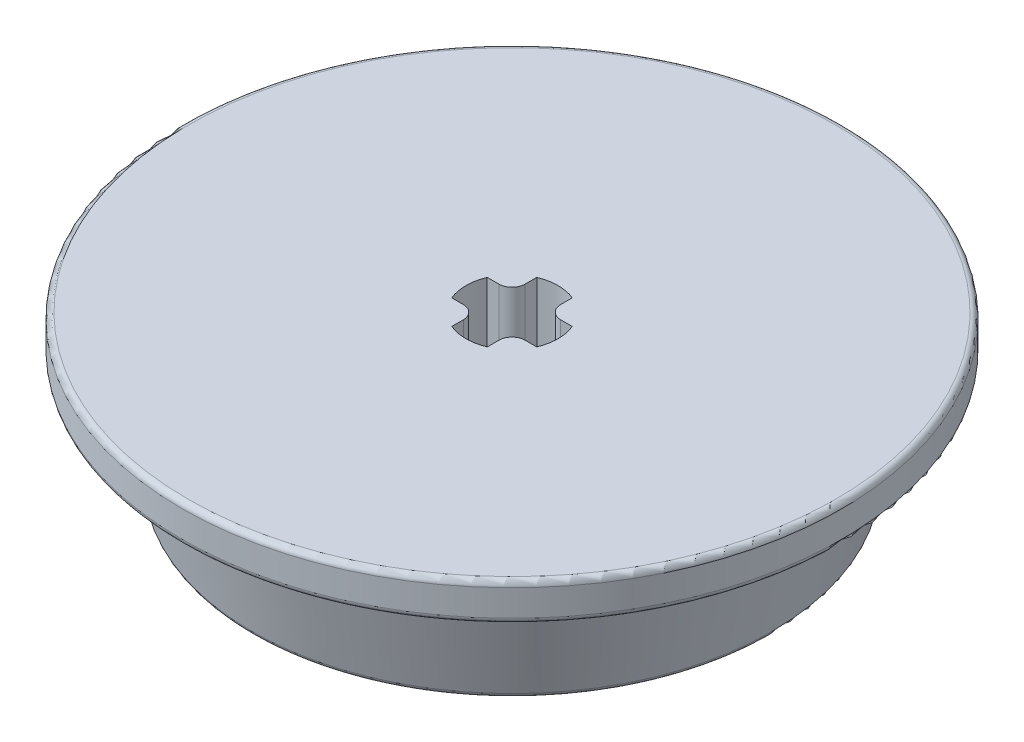
ISO-10303-21;
HEADER;
FILE_DESCRIPTION(('STEP AP214'),'2;1');
FILE_NAME('part.step','',(''),(''),'','','');
FILE_SCHEMA(('AUTOMOTIVE_DESIGN { 1 0 10303 214 1 1 1 1 }'));
ENDSEC;
DATA;
#1=APPLICATION_CONTEXT('core data for automotive mechanical design processes');
#2=APPLICATION_PROTOCOL_DEFINITION('international standard','automotive_design',2000,#1);
#3=PRODUCT_CONTEXT('',#1,'mechanical');
#4=PRODUCT('Part','Part','',(#3));
#5=PRODUCT_RELATED_PRODUCT_CATEGORY('part','',(#4));
#6=PRODUCT_DEFINITION_FORMATION('','',#4);
#7=PRODUCT_DEFINITION_CONTEXT('part definition',#1,'design');
#8=PRODUCT_DEFINITION('design','',#6,#7);
#9=PRODUCT_DEFINITION_SHAPE('','',#8);
#10=(LENGTH_UNIT() NAMED_UNIT(*) SI_UNIT(.MILLI.,.METRE.));
#11=(NAMED_UNIT(*) PLANE_ANGLE_UNIT() SI_UNIT($,.RADIAN.));
#12=(NAMED_UNIT(*) SI_UNIT($,.STERADIAN.) SOLID_ANGLE_UNIT());
#13=UNCERTAINTY_MEASURE_WITH_UNIT(LENGTH_MEASURE(1.E-05),#10,'distance_accuracy_value','');
#14=(GEOMETRIC_REPRESENTATION_CONTEXT(3) GLOBAL_UNCERTAINTY_ASSIGNED_CONTEXT((#13)) GLOBAL_UNIT_ASSIGNED_CONTEXT((#10,
#11,#12)) REPRESENTATION_CONTEXT('',''));
#15=CARTESIAN_POINT('',(0.,0.,0.));
#16=DIRECTION('',(0.,0.,1.));
#17=DIRECTION('',(1.,0.,0.));
#18=AXIS2_PLACEMENT_3D('',#15,#16,#17);
#19=CARTESIAN_POINT('',(0.,0.,0.));
#20=DIRECTION('',(0.,1.,0.));
#21=DIRECTION('',(0.,0.,1.));
#22=AXIS2_PLACEMENT_3D('',#19,#20,#21);
#23=PLANE('',#22);
#24=CARTESIAN_POINT('',(0.,0.,0.));
#25=DIRECTION('',(0.,1.,0.));
#26=DIRECTION('',(0.,0.,1.));
#27=AXIS2_PLACEMENT_3D('',#24,#25,#26);
#28=CIRCLE('',#27,17.1604709958205);
#29=CARTESIAN_POINT('',(0.,0.,17.1604709958205));
#30=VERTEX_POINT('',#29);
#31=EDGE_CURVE('E293',#30,#30,#28,.T.);
#32=ORIENTED_EDGE('',*,*,#31,.T.);
#33=EDGE_LOOP('',(#32));
#34=FACE_BOUND('',#33,.T.);
#35=DIRECTION('',(0.,0.,1.));
#36=VECTOR('',#35,1.);
#37=CARTESIAN_POINT('',(-0.940000000000001,0.,0.940000000000009));
#38=LINE('',#37,#36);
#39=CARTESIAN_POINT('',(-0.940000000000001,0.,1.64000000000001));
#40=VERTEX_POINT('',#39);
#41=CARTESIAN_POINT('',(-0.94,0.,2.25166604983954));
#42=VERTEX_POINT('',#41);
#43=EDGE_CURVE('E210',#40,#42,#38,.T.);
#44=ORIENTED_EDGE('',*,*,#43,.F.);
#45=CARTESIAN_POINT('',(-1.64,0.,1.64000000000001));
#46=DIRECTION('',(0.,1.,0.));
#47=DIRECTION('',(0.,0.,1.));
#48=AXIS2_PLACEMENT_3D('',#45,#46,#47);
#49=CIRCLE('',#48,0.7);
#50=CARTESIAN_POINT('',(-1.64,0.,0.940000000000009));
#51=VERTEX_POINT('',#50);
#52=EDGE_CURVE('E254',#40,#51,#49,.T.);
#53=ORIENTED_EDGE('',*,*,#52,.T.);
#54=DIRECTION('',(1.,0.,0.));
#55=VECTOR('',#54,1.);
#56=CARTESIAN_POINT('',(-2.25166604983954,0.,0.940000000000009));
#57=LINE('',#56,#55);
#58=CARTESIAN_POINT('',(-2.25166604983954,0.,0.940000000000008));
#59=VERTEX_POINT('',#58);
#60=EDGE_CURVE('E208',#59,#51,#57,.T.);
#61=ORIENTED_EDGE('',*,*,#60,.F.);
#62=CARTESIAN_POINT('',(0.,0.,0.));
#63=DIRECTION('',(0.,1.,0.));
#64=DIRECTION('',(0.,0.,1.));
#65=AXIS2_PLACEMENT_3D('',#62,#63,#64);
#66=CIRCLE('',#65,2.44);
#67=CARTESIAN_POINT('',(-2.25166604983954,0.,-0.940000000000009));
#68=VERTEX_POINT('',#67);
#69=EDGE_CURVE('E160',#68,#59,#66,.T.);
#70=ORIENTED_EDGE('',*,*,#69,.F.);
#71=DIRECTION('',(-1.,0.,0.));
#72=VECTOR('',#71,1.);
#73=CARTESIAN_POINT('',(-0.94,0.,-0.940000000000009));
#74=LINE('',#73,#72);
#75=CARTESIAN_POINT('',(-1.64,0.,-0.940000000000009));
#76=VERTEX_POINT('',#75);
#77=EDGE_CURVE('E205',#76,#68,#74,.T.);
#78=ORIENTED_EDGE('',*,*,#77,.F.);
#79=CARTESIAN_POINT('',(-1.64,0.,-1.64000000000001));
#80=DIRECTION('',(0.,1.,0.));
#81=DIRECTION('',(0.,0.,1.));
#82=AXIS2_PLACEMENT_3D('',#79,#80,#81);
#83=CIRCLE('',#82,0.7);
#84=CARTESIAN_POINT('',(-0.94,0.,-1.64000000000001));
#85=VERTEX_POINT('',#84);
#86=EDGE_CURVE('E248',#76,#85,#83,.T.);
#87=ORIENTED_EDGE('',*,*,#86,.T.);
#88=DIRECTION('',(0.,0.,1.));
#89=VECTOR('',#88,1.);
#90=CARTESIAN_POINT('',(-0.94,0.,-2.25166604983954));
#91=LINE('',#90,#89);
#92=CARTESIAN_POINT('',(-0.940000000000001,0.,-2.25166604983954));
#93=VERTEX_POINT('',#92);
#94=EDGE_CURVE('E202',#93,#85,#91,.T.);
#95=ORIENTED_EDGE('',*,*,#94,.F.);
#96=CARTESIAN_POINT('',(0.,0.,0.));
#97=DIRECTION('',(0.,1.,0.));
#98=DIRECTION('',(0.,0.,-1.));
#99=AXIS2_PLACEMENT_3D('',#96,#97,#98);
#100=CIRCLE('',#99,2.44);
#101=CARTESIAN_POINT('',(0.94,0.,-2.25166604983954));
#102=VERTEX_POINT('',#101);
#103=EDGE_CURVE('E227',#102,#93,#100,.T.);
#104=ORIENTED_EDGE('',*,*,#103,.F.);
#105=DIRECTION('',(0.,0.,-1.));
#106=VECTOR('',#105,1.);
#107=CARTESIAN_POINT('',(0.94,0.,-2.25166604983954));
#108=LINE('',#107,#106);
#109=CARTESIAN_POINT('',(0.94,0.,-1.64));
#110=VERTEX_POINT('',#109);
#111=EDGE_CURVE('E225',#110,#102,#108,.T.);
#112=ORIENTED_EDGE('',*,*,#111,.F.);
#113=CARTESIAN_POINT('',(1.64,0.,-1.64));
#114=DIRECTION('',(0.,1.,0.));
#115=DIRECTION('',(0.,0.,1.));
#116=AXIS2_PLACEMENT_3D('',#113,#114,#115);
#117=CIRCLE('',#116,0.7);
#118=CARTESIAN_POINT('',(1.64,0.,-0.940000000000003));
#119=VERTEX_POINT('',#118);
#120=EDGE_CURVE('E250',#110,#119,#117,.T.);
#121=ORIENTED_EDGE('',*,*,#120,.T.);
#122=DIRECTION('',(-1.,0.,0.));
#123=VECTOR('',#122,1.);
#124=CARTESIAN_POINT('',(0.94,0.,-0.940000000000003));
#125=LINE('',#124,#123);
#126=CARTESIAN_POINT('',(2.25166604983954,0.,-0.940000000000003));
#127=VERTEX_POINT('',#126);
#128=EDGE_CURVE('E223',#127,#119,#125,.T.);
#129=ORIENTED_EDGE('',*,*,#128,.F.);
#130=CARTESIAN_POINT('',(0.,0.,0.));
#131=DIRECTION('',(0.,1.,0.));
#132=DIRECTION('',(0.,0.,-1.));
#133=AXIS2_PLACEMENT_3D('',#130,#131,#132);
#134=CIRCLE('',#133,2.44);
#135=CARTESIAN_POINT('',(2.25166604983954,0.,0.940000000000003));
#136=VERTEX_POINT('',#135);
#137=EDGE_CURVE('E220',#136,#127,#134,.T.);
#138=ORIENTED_EDGE('',*,*,#137,.F.);
#139=DIRECTION('',(1.,0.,0.));
#140=VECTOR('',#139,1.);
#141=CARTESIAN_POINT('',(0.940000000000001,0.,0.940000000000003));
#142=LINE('',#141,#140);
#143=CARTESIAN_POINT('',(1.64,0.,0.940000000000003));
#144=VERTEX_POINT('',#143);
#145=EDGE_CURVE('E218',#144,#136,#142,.T.);
#146=ORIENTED_EDGE('',*,*,#145,.F.);
#147=CARTESIAN_POINT('',(1.64,0.,1.64));
#148=DIRECTION('',(0.,1.,0.));
#149=DIRECTION('',(0.,0.,1.));
#150=AXIS2_PLACEMENT_3D('',#147,#148,#149);
#151=CIRCLE('',#150,0.7);
#152=CARTESIAN_POINT('',(0.940000000000001,0.,1.64));
#153=VERTEX_POINT('',#152);
#154=EDGE_CURVE('E252',#144,#153,#151,.T.);
#155=ORIENTED_EDGE('',*,*,#154,.T.);
#156=DIRECTION('',(0.,0.,-1.));
#157=VECTOR('',#156,1.);
#158=CARTESIAN_POINT('',(0.940000000000001,0.,2.25166604983954));
#159=LINE('',#158,#157);
#160=CARTESIAN_POINT('',(0.94,0.,2.25166604983954));
#161=VERTEX_POINT('',#160);
#162=EDGE_CURVE('E215',#161,#153,#159,.T.);
#163=ORIENTED_EDGE('',*,*,#162,.F.);
#164=CARTESIAN_POINT('',(0.,0.,0.));
#165=DIRECTION('',(0.,1.,0.));
#166=DIRECTION('',(0.,0.,1.));
#167=AXIS2_PLACEMENT_3D('',#164,#165,#166);
#168=CIRCLE('',#167,2.44);
#169=EDGE_CURVE('E212',#42,#161,#168,.T.);
#170=ORIENTED_EDGE('',*,*,#169,.F.);
#171=EDGE_LOOP('',(#44,#53,#61,#70,#78,#87,#95,#104,#112,#121,#129,#138,#146,#155,#163,#170));
#172=FACE_BOUND('',#171,.T.);
#173=ADVANCED_FACE('F37',(#34,#172),#23,.T.);
#174=CARTESIAN_POINT('',(0.,0.,0.));
#175=DIRECTION('',(0.,-1.,0.));
#176=DIRECTION('',(0.,0.,-1.));
#177=AXIS2_PLACEMENT_3D('',#174,#175,#176);
#178=CYLINDRICAL_SURFACE('',#177,17.4604709958205);
#179=CARTESIAN_POINT('',(0.,-0.3,0.));
#180=DIRECTION('',(0.,1.,0.));
#181=DIRECTION('',(0.,0.,1.));
#182=AXIS2_PLACEMENT_3D('',#179,#180,#181);
#183=CIRCLE('',#182,17.4604709958205);
#184=CARTESIAN_POINT('',(0.,-0.3,17.4604709958205));
#185=VERTEX_POINT('',#184);
#186=EDGE_CURVE('E290',#185,#185,#183,.F.);
#187=ORIENTED_EDGE('',*,*,#186,.T.);
#188=EDGE_LOOP('',(#187));
#189=FACE_BOUND('',#188,.T.);
#190=CARTESIAN_POINT('',(0.,-1.7,0.));
#191=DIRECTION('',(0.,-1.,0.));
#192=DIRECTION('',(0.,0.,-1.));
#193=AXIS2_PLACEMENT_3D('',#190,#191,#192);
#194=CIRCLE('',#193,17.4604709958205);
#195=CARTESIAN_POINT('',(0.,-1.7,-17.4604709958205));
#196=VERTEX_POINT('',#195);
#197=EDGE_CURVE('E287',#196,#196,#194,.F.);
#198=ORIENTED_EDGE('',*,*,#197,.T.);
#199=EDGE_LOOP('',(#198));
#200=FACE_BOUND('',#199,.T.);
#201=ADVANCED_FACE('F310',(#189,#200),#178,.T.);
#202=CARTESIAN_POINT('',(17.4604709958205,-2.,0.));
#203=DIRECTION('',(0.,-1.,0.));
#204=DIRECTION('',(0.,0.,-1.));
#205=AXIS2_PLACEMENT_3D('',#202,#203,#204);
#206=PLANE('',#205);
#207=CARTESIAN_POINT('',(0.,-2.,0.));
#208=DIRECTION('',(0.,-1.,0.));
#209=DIRECTION('',(0.,0.,-1.));
#210=AXIS2_PLACEMENT_3D('',#207,#208,#209);
#211=CIRCLE('',#210,15.2429352099588);
#212=CARTESIAN_POINT('',(0.,-2.,-15.2429352099588));
#213=VERTEX_POINT('',#212);
#214=EDGE_CURVE('E11',#213,#213,#211,.F.);
#215=ORIENTED_EDGE('',*,*,#214,.T.);
#216=EDGE_LOOP('',(#215));
#217=FACE_BOUND('',#216,.T.);
#218=CARTESIAN_POINT('',(0.,-2.,0.));
#219=DIRECTION('',(0.,-1.,0.));
#220=DIRECTION('',(0.,0.,-1.));
#221=AXIS2_PLACEMENT_3D('',#218,#219,#220);
#222=CIRCLE('',#221,17.1604709958205);
#223=CARTESIAN_POINT('',(0.,-2.,-17.1604709958205));
#224=VERTEX_POINT('',#223);
#225=EDGE_CURVE('E45',#224,#224,#222,.T.);
#226=ORIENTED_EDGE('',*,*,#225,.T.);
#227=EDGE_LOOP('',(#226));
#228=FACE_BOUND('',#227,.T.);
#229=ADVANCED_FACE('F298',(#217,#228),#206,.T.);
#230=CARTESIAN_POINT('',(0.,-8.,0.));
#231=DIRECTION('',(0.,1.,0.));
#232=DIRECTION('',(0.,0.,1.));
#233=AXIS2_PLACEMENT_3D('',#230,#231,#232);
#234=CONICAL_SURFACE('',#233,13.7246606299877,0.209439510238075);
#235=CARTESIAN_POINT('',(0.,-7.76237350724496,0.));
#236=DIRECTION('',(0.,-1.,0.));
#237=DIRECTION('',(0.,0.,-1.));
#238=AXIS2_PLACEMENT_3D('',#235,#236,#237);
#239=CIRCLE('',#238,13.7751697002491);
#240=CARTESIAN_POINT('',(0.,-7.76237350724496,-13.7751697002491));
#241=VERTEX_POINT('',#240);
#242=EDGE_CURVE('E284',#241,#241,#239,.F.);
#243=ORIENTED_EDGE('',*,*,#242,.T.);
#244=EDGE_LOOP('',(#243));
#245=FACE_BOUND('',#244,.T.);
#246=CARTESIAN_POINT('',(0.,-2.23762649275504,0.));
#247=DIRECTION('',(0.,1.,0.));
#248=DIRECTION('',(0.,0.,1.));
#249=AXIS2_PLACEMENT_3D('',#246,#247,#248);
#250=CIRCLE('',#249,14.9494909297386);
#251=CARTESIAN_POINT('',(0.,-2.23762649275504,14.9494909297386));
#252=VERTEX_POINT('',#251);
#253=EDGE_CURVE('E281',#252,#252,#250,.F.);
#254=ORIENTED_EDGE('',*,*,#253,.T.);
#255=EDGE_LOOP('',(#254));
#256=FACE_BOUND('',#255,.T.);
#257=ADVANCED_FACE('F520',(#245,#256),#234,.T.);
#258=CARTESIAN_POINT('',(13.7246606299877,-8.,0.));
#259=DIRECTION('',(0.,-1.,0.));
#260=DIRECTION('',(0.,0.,-1.));
#261=AXIS2_PLACEMENT_3D('',#258,#259,#260);
#262=PLANE('',#261);
#263=CARTESIAN_POINT('',(0.,-8.,0.));
#264=DIRECTION('',(0.,-1.,0.));
#265=DIRECTION('',(0.,0.,-1.));
#266=AXIS2_PLACEMENT_3D('',#263,#264,#265);
#267=CIRCLE('',#266,13.4817254200289);
#268=CARTESIAN_POINT('',(0.,-8.,-13.4817254200289));
#269=VERTEX_POINT('',#268);
#270=EDGE_CURVE('E278',#269,#269,#267,.T.);
#271=ORIENTED_EDGE('',*,*,#270,.T.);
#272=EDGE_LOOP('',(#271));
#273=FACE_BOUND('',#272,.T.);
#274=DIRECTION('',(1.,0.,0.));
#275=VECTOR('',#274,1.);
#276=CARTESIAN_POINT('',(-2.25166604983954,-8.,0.940000000000009));
#277=LINE('',#276,#275);
#278=CARTESIAN_POINT('',(-2.25166604983954,-8.,0.940000000000008));
#279=VERTEX_POINT('',#278);
#280=CARTESIAN_POINT('',(-1.64,-8.,0.940000000000009));
#281=VERTEX_POINT('',#280);
#282=EDGE_CURVE('E168',#279,#281,#277,.T.);
#283=ORIENTED_EDGE('',*,*,#282,.T.);
#284=CARTESIAN_POINT('',(-1.64,-8.,1.64000000000001));
#285=DIRECTION('',(0.,-1.,0.));
#286=DIRECTION('',(0.,0.,-1.));
#287=AXIS2_PLACEMENT_3D('',#284,#285,#286);
#288=CIRCLE('',#287,0.7);
#289=CARTESIAN_POINT('',(-0.940000000000001,-8.,1.64000000000001));
#290=VERTEX_POINT('',#289);
#291=EDGE_CURVE('E262',#281,#290,#288,.T.);
#292=ORIENTED_EDGE('',*,*,#291,.T.);
#293=DIRECTION('',(0.,0.,1.));
#294=VECTOR('',#293,1.);
#295=CARTESIAN_POINT('',(-0.940000000000001,-8.,0.940000000000009));
#296=LINE('',#295,#294);
#297=CARTESIAN_POINT('',(-0.94,-8.,2.25166604983954));
#298=VERTEX_POINT('',#297);
#299=EDGE_CURVE('E173',#290,#298,#296,.T.);
#300=ORIENTED_EDGE('',*,*,#299,.T.);
#301=CARTESIAN_POINT('',(0.,-8.,0.));
#302=DIRECTION('',(0.,1.,0.));
#303=DIRECTION('',(0.,0.,1.));
#304=AXIS2_PLACEMENT_3D('',#301,#302,#303);
#305=CIRCLE('',#304,2.44);
#306=CARTESIAN_POINT('',(0.94,-8.,2.25166604983954));
#307=VERTEX_POINT('',#306);
#308=EDGE_CURVE('E184',#298,#307,#305,.T.);
#309=ORIENTED_EDGE('',*,*,#308,.T.);
#310=DIRECTION('',(0.,0.,-1.));
#311=VECTOR('',#310,1.);
#312=CARTESIAN_POINT('',(0.940000000000001,-8.,2.25166604983954));
#313=LINE('',#312,#311);
#314=CARTESIAN_POINT('',(0.940000000000001,-8.,1.64));
#315=VERTEX_POINT('',#314);
#316=EDGE_CURVE('E187',#307,#315,#313,.T.);
#317=ORIENTED_EDGE('',*,*,#316,.T.);
#318=CARTESIAN_POINT('',(1.64,-8.,1.64));
#319=DIRECTION('',(0.,-1.,0.));
#320=DIRECTION('',(0.,0.,-1.));
#321=AXIS2_PLACEMENT_3D('',#318,#319,#320);
#322=CIRCLE('',#321,0.7);
#323=CARTESIAN_POINT('',(1.64,-8.,0.940000000000003));
#324=VERTEX_POINT('',#323);
#325=EDGE_CURVE('E260',#315,#324,#322,.T.);
#326=ORIENTED_EDGE('',*,*,#325,.T.);
#327=DIRECTION('',(1.,0.,0.));
#328=VECTOR('',#327,1.);
#329=CARTESIAN_POINT('',(0.940000000000001,-8.,0.940000000000003));
#330=LINE('',#329,#328);
#331=CARTESIAN_POINT('',(2.25166604983954,-8.,0.940000000000003));
#332=VERTEX_POINT('',#331);
#333=EDGE_CURVE('E190',#324,#332,#330,.T.);
#334=ORIENTED_EDGE('',*,*,#333,.T.);
#335=CARTESIAN_POINT('',(0.,-8.,0.));
#336=DIRECTION('',(0.,1.,0.));
#337=DIRECTION('',(0.,0.,-1.));
#338=AXIS2_PLACEMENT_3D('',#335,#336,#337);
#339=CIRCLE('',#338,2.44);
#340=CARTESIAN_POINT('',(2.25166604983954,-8.,-0.940000000000003));
#341=VERTEX_POINT('',#340);
#342=EDGE_CURVE('E192',#332,#341,#339,.T.);
#343=ORIENTED_EDGE('',*,*,#342,.T.);
#344=DIRECTION('',(-1.,0.,0.));
#345=VECTOR('',#344,1.);
#346=CARTESIAN_POINT('',(0.94,-8.,-0.940000000000003));
#347=LINE('',#346,#345);
#348=CARTESIAN_POINT('',(1.64,-8.,-0.940000000000003));
#349=VERTEX_POINT('',#348);
#350=EDGE_CURVE('E195',#341,#349,#347,.T.);
#351=ORIENTED_EDGE('',*,*,#350,.T.);
#352=CARTESIAN_POINT('',(1.64,-8.,-1.64));
#353=DIRECTION('',(0.,-1.,0.));
#354=DIRECTION('',(0.,0.,-1.));
#355=AXIS2_PLACEMENT_3D('',#352,#353,#354);
#356=CIRCLE('',#355,0.7);
#357=CARTESIAN_POINT('',(0.94,-8.,-1.64));
#358=VERTEX_POINT('',#357);
#359=EDGE_CURVE('E52',#349,#358,#356,.T.);
#360=ORIENTED_EDGE('',*,*,#359,.T.);
#361=DIRECTION('',(0.,0.,-1.));
#362=VECTOR('',#361,1.);
#363=CARTESIAN_POINT('',(0.94,-8.,-2.25166604983954));
#364=LINE('',#363,#362);
#365=CARTESIAN_POINT('',(0.94,-8.,-2.25166604983954));
#366=VERTEX_POINT('',#365);
#367=EDGE_CURVE('E197',#358,#366,#364,.T.);
#368=ORIENTED_EDGE('',*,*,#367,.T.);
#369=CARTESIAN_POINT('',(0.,-8.,0.));
#370=DIRECTION('',(0.,1.,0.));
#371=DIRECTION('',(0.,0.,-1.));
#372=AXIS2_PLACEMENT_3D('',#369,#370,#371);
#373=CIRCLE('',#372,2.44);
#374=CARTESIAN_POINT('',(-0.940000000000001,-8.,-2.25166604983954));
#375=VERTEX_POINT('',#374);
#376=EDGE_CURVE('E199',#366,#375,#373,.T.);
#377=ORIENTED_EDGE('',*,*,#376,.T.);
#378=DIRECTION('',(0.,0.,1.));
#379=VECTOR('',#378,1.);
#380=CARTESIAN_POINT('',(-0.94,-8.,-2.25166604983954));
#381=LINE('',#380,#379);
#382=CARTESIAN_POINT('',(-0.94,-8.,-1.64000000000001));
#383=VERTEX_POINT('',#382);
#384=EDGE_CURVE('E179',#375,#383,#381,.T.);
#385=ORIENTED_EDGE('',*,*,#384,.T.);
#386=CARTESIAN_POINT('',(-1.64,-8.,-1.64000000000001));
#387=DIRECTION('',(0.,-1.,0.));
#388=DIRECTION('',(0.,0.,-1.));
#389=AXIS2_PLACEMENT_3D('',#386,#387,#388);
#390=CIRCLE('',#389,0.7);
#391=CARTESIAN_POINT('',(-1.64,-8.,-0.940000000000009));
#392=VERTEX_POINT('',#391);
#393=EDGE_CURVE('E257',#383,#392,#390,.T.);
#394=ORIENTED_EDGE('',*,*,#393,.T.);
#395=DIRECTION('',(-1.,0.,0.));
#396=VECTOR('',#395,1.);
#397=CARTESIAN_POINT('',(-0.94,-8.,-0.940000000000009));
#398=LINE('',#397,#396);
#399=CARTESIAN_POINT('',(-2.25166604983954,-8.,-0.940000000000009));
#400=VERTEX_POINT('',#399);
#401=EDGE_CURVE('E177',#392,#400,#398,.T.);
#402=ORIENTED_EDGE('',*,*,#401,.T.);
#403=CARTESIAN_POINT('',(0.,-8.,0.));
#404=DIRECTION('',(0.,1.,0.));
#405=DIRECTION('',(0.,0.,1.));
#406=AXIS2_PLACEMENT_3D('',#403,#404,#405);
#407=CIRCLE('',#406,2.44);
#408=EDGE_CURVE('E157',#400,#279,#407,.T.);
#409=ORIENTED_EDGE('',*,*,#408,.T.);
#410=EDGE_LOOP('',(#283,#292,#300,#309,#317,#326,#334,#343,#351,#360,#368,#377,#385,#394,#402,#409));
#411=FACE_BOUND('',#410,.T.);
#412=ADVANCED_FACE('F175',(#273,#411),#262,.T.);
#413=CARTESIAN_POINT('',(-0.94,-8.,-2.25166604983954));
#414=DIRECTION('',(-1.,0.,0.));
#415=DIRECTION('',(0.,0.,1.));
#416=AXIS2_PLACEMENT_3D('',#413,#414,#415);
#417=PLANE('',#416);
#418=ORIENTED_EDGE('',*,*,#94,.T.);
#419=DIRECTION('',(0.,1.,0.));
#420=VECTOR('',#419,1.);
#421=CARTESIAN_POINT('',(-0.94,-8.,-1.64000000000001));
#422=LINE('',#421,#420);
#423=EDGE_CURVE('E276',#85,#383,#422,.F.);
#424=ORIENTED_EDGE('',*,*,#423,.T.);
#425=ORIENTED_EDGE('',*,*,#384,.F.);
#426=DIRECTION('',(0.,1.,0.));
#427=VECTOR('',#426,1.);
#428=CARTESIAN_POINT('',(-0.940000000000001,-8.,-2.25166604983954));
#429=LINE('',#428,#427);
#430=EDGE_CURVE('E230',#375,#93,#429,.T.);
#431=ORIENTED_EDGE('',*,*,#430,.T.);
#432=EDGE_LOOP('',(#418,#424,#425,#431));
#433=FACE_BOUND('',#432,.T.);
#434=ADVANCED_FACE('F501',(#433),#417,.F.);
#435=CARTESIAN_POINT('',(0.,-8.,0.));
#436=DIRECTION('',(0.,1.,0.));
#437=DIRECTION('',(0.,0.,1.));
#438=AXIS2_PLACEMENT_3D('',#435,#436,#437);
#439=CYLINDRICAL_SURFACE('',#438,2.44);
#440=ORIENTED_EDGE('',*,*,#103,.T.);
#441=ORIENTED_EDGE('',*,*,#430,.F.);
#442=ORIENTED_EDGE('',*,*,#376,.F.);
#443=DIRECTION('',(0.,1.,0.));
#444=VECTOR('',#443,1.);
#445=CARTESIAN_POINT('',(0.94,-8.,-2.25166604983954));
#446=LINE('',#445,#444);
#447=EDGE_CURVE('E233',#366,#102,#446,.T.);
#448=ORIENTED_EDGE('',*,*,#447,.T.);
#449=EDGE_LOOP('',(#440,#441,#442,#448));
#450=FACE_BOUND('',#449,.T.);
#451=ADVANCED_FACE('F491',(#450),#439,.F.);
#452=CARTESIAN_POINT('',(0.94,-8.,-2.25166604983954));
#453=DIRECTION('',(1.,0.,0.));
#454=DIRECTION('',(0.,0.,-1.));
#455=AXIS2_PLACEMENT_3D('',#452,#453,#454);
#456=PLANE('',#455);
#457=ORIENTED_EDGE('',*,*,#367,.F.);
#458=DIRECTION('',(0.,1.,0.));
#459=VECTOR('',#458,1.);
#460=CARTESIAN_POINT('',(0.94,-8.,-1.64));
#461=LINE('',#460,#459);
#462=EDGE_CURVE('E269',#358,#110,#461,.T.);
#463=ORIENTED_EDGE('',*,*,#462,.T.);
#464=ORIENTED_EDGE('',*,*,#111,.T.);
#465=ORIENTED_EDGE('',*,*,#447,.F.);
#466=EDGE_LOOP('',(#457,#463,#464,#465));
#467=FACE_BOUND('',#466,.T.);
#468=ADVANCED_FACE('F482',(#467),#456,.F.);
#469=CARTESIAN_POINT('',(0.94,-8.,-0.940000000000003));
#470=DIRECTION('',(0.,0.,-1.));
#471=DIRECTION('',(-1.,0.,0.));
#472=AXIS2_PLACEMENT_3D('',#469,#470,#471);
#473=PLANE('',#472);
#474=ORIENTED_EDGE('',*,*,#128,.T.);
#475=DIRECTION('',(0.,1.,0.));
#476=VECTOR('',#475,1.);
#477=CARTESIAN_POINT('',(1.64,-8.,-0.940000000000003));
#478=LINE('',#477,#476);
#479=EDGE_CURVE('E60',#119,#349,#478,.F.);
#480=ORIENTED_EDGE('',*,*,#479,.T.);
#481=ORIENTED_EDGE('',*,*,#350,.F.);
#482=DIRECTION('',(0.,1.,0.));
#483=VECTOR('',#482,1.);
#484=CARTESIAN_POINT('',(2.25166604983954,-8.,-0.940000000000003));
#485=LINE('',#484,#483);
#486=EDGE_CURVE('E236',#341,#127,#485,.T.);
#487=ORIENTED_EDGE('',*,*,#486,.T.);
#488=EDGE_LOOP('',(#474,#480,#481,#487));
#489=FACE_BOUND('',#488,.T.);
#490=ADVANCED_FACE('F472',(#489),#473,.F.);
#491=CARTESIAN_POINT('',(0.,-8.,0.));
#492=DIRECTION('',(0.,1.,0.));
#493=DIRECTION('',(0.,0.,1.));
#494=AXIS2_PLACEMENT_3D('',#491,#492,#493);
#495=CYLINDRICAL_SURFACE('',#494,2.44);
#496=ORIENTED_EDGE('',*,*,#137,.T.);
#497=ORIENTED_EDGE('',*,*,#486,.F.);
#498=ORIENTED_EDGE('',*,*,#342,.F.);
#499=DIRECTION('',(0.,1.,0.));
#500=VECTOR('',#499,1.);
#501=CARTESIAN_POINT('',(2.25166604983954,-8.,0.940000000000003));
#502=LINE('',#501,#500);
#503=EDGE_CURVE('E238',#332,#136,#502,.T.);
#504=ORIENTED_EDGE('',*,*,#503,.T.);
#505=EDGE_LOOP('',(#496,#497,#498,#504));
#506=FACE_BOUND('',#505,.T.);
#507=ADVANCED_FACE('F462',(#506),#495,.F.);
#508=CARTESIAN_POINT('',(0.940000000000001,-8.,0.940000000000003));
#509=DIRECTION('',(0.,0.,1.));
#510=DIRECTION('',(1.,0.,0.));
#511=AXIS2_PLACEMENT_3D('',#508,#509,#510);
#512=PLANE('',#511);
#513=ORIENTED_EDGE('',*,*,#333,.F.);
#514=DIRECTION('',(0.,1.,0.));
#515=VECTOR('',#514,1.);
#516=CARTESIAN_POINT('',(1.64,-8.,0.940000000000003));
#517=LINE('',#516,#515);
#518=EDGE_CURVE('E264',#324,#144,#517,.T.);
#519=ORIENTED_EDGE('',*,*,#518,.T.);
#520=ORIENTED_EDGE('',*,*,#145,.T.);
#521=ORIENTED_EDGE('',*,*,#503,.F.);
#522=EDGE_LOOP('',(#513,#519,#520,#521));
#523=FACE_BOUND('',#522,.T.);
#524=ADVANCED_FACE('F452',(#523),#512,.F.);
#525=CARTESIAN_POINT('',(0.940000000000001,-8.,2.25166604983954));
#526=DIRECTION('',(1.,0.,0.));
#527=DIRECTION('',(0.,0.,-1.));
#528=AXIS2_PLACEMENT_3D('',#525,#526,#527);
#529=PLANE('',#528);
#530=ORIENTED_EDGE('',*,*,#162,.T.);
#531=DIRECTION('',(0.,1.,0.));
#532=VECTOR('',#531,1.);
#533=CARTESIAN_POINT('',(0.940000000000001,-8.,1.64));
#534=LINE('',#533,#532);
#535=EDGE_CURVE('E267',#153,#315,#534,.F.);
#536=ORIENTED_EDGE('',*,*,#535,.T.);
#537=ORIENTED_EDGE('',*,*,#316,.F.);
#538=DIRECTION('',(0.,1.,0.));
#539=VECTOR('',#538,1.);
#540=CARTESIAN_POINT('',(0.94,-8.,2.25166604983954));
#541=LINE('',#540,#539);
#542=EDGE_CURVE('E241',#307,#161,#541,.T.);
#543=ORIENTED_EDGE('',*,*,#542,.T.);
#544=EDGE_LOOP('',(#530,#536,#537,#543));
#545=FACE_BOUND('',#544,.T.);
#546=ADVANCED_FACE('F442',(#545),#529,.F.);
#547=CARTESIAN_POINT('',(0.,-8.,0.));
#548=DIRECTION('',(0.,1.,0.));
#549=DIRECTION('',(0.,0.,1.));
#550=AXIS2_PLACEMENT_3D('',#547,#548,#549);
#551=CYLINDRICAL_SURFACE('',#550,2.44);
#552=ORIENTED_EDGE('',*,*,#169,.T.);
#553=ORIENTED_EDGE('',*,*,#542,.F.);
#554=ORIENTED_EDGE('',*,*,#308,.F.);
#555=DIRECTION('',(0.,1.,0.));
#556=VECTOR('',#555,1.);
#557=CARTESIAN_POINT('',(-0.94,-8.,2.25166604983954));
#558=LINE('',#557,#556);
#559=EDGE_CURVE('E164',#298,#42,#558,.T.);
#560=ORIENTED_EDGE('',*,*,#559,.T.);
#561=EDGE_LOOP('',(#552,#553,#554,#560));
#562=FACE_BOUND('',#561,.T.);
#563=ADVANCED_FACE('F432',(#562),#551,.F.);
#564=CARTESIAN_POINT('',(-0.940000000000001,-8.,0.940000000000009));
#565=DIRECTION('',(-1.,0.,0.));
#566=DIRECTION('',(0.,0.,1.));
#567=AXIS2_PLACEMENT_3D('',#564,#565,#566);
#568=PLANE('',#567);
#569=ORIENTED_EDGE('',*,*,#299,.F.);
#570=DIRECTION('',(0.,1.,0.));
#571=VECTOR('',#570,1.);
#572=CARTESIAN_POINT('',(-0.940000000000001,-8.,1.64000000000001));
#573=LINE('',#572,#571);
#574=EDGE_CURVE('E232',#290,#40,#573,.T.);
#575=ORIENTED_EDGE('',*,*,#574,.T.);
#576=ORIENTED_EDGE('',*,*,#43,.T.);
#577=ORIENTED_EDGE('',*,*,#559,.F.);
#578=EDGE_LOOP('',(#569,#575,#576,#577));
#579=FACE_BOUND('',#578,.T.);
#580=ADVANCED_FACE('F423',(#579),#568,.F.);
#581=CARTESIAN_POINT('',(-2.25166604983954,-8.,0.940000000000009));
#582=DIRECTION('',(0.,0.,1.));
#583=DIRECTION('',(1.,0.,0.));
#584=AXIS2_PLACEMENT_3D('',#581,#582,#583);
#585=PLANE('',#584);
#586=ORIENTED_EDGE('',*,*,#60,.T.);
#587=DIRECTION('',(0.,1.,0.));
#588=VECTOR('',#587,1.);
#589=CARTESIAN_POINT('',(-1.64,-8.,0.940000000000009));
#590=LINE('',#589,#588);
#591=EDGE_CURVE('E171',#51,#281,#590,.F.);
#592=ORIENTED_EDGE('',*,*,#591,.T.);
#593=ORIENTED_EDGE('',*,*,#282,.F.);
#594=DIRECTION('',(0.,1.,0.));
#595=VECTOR('',#594,1.);
#596=CARTESIAN_POINT('',(-2.25166604983954,-8.,0.940000000000008));
#597=LINE('',#596,#595);
#598=EDGE_CURVE('E152',#279,#59,#597,.T.);
#599=ORIENTED_EDGE('',*,*,#598,.T.);
#600=EDGE_LOOP('',(#586,#592,#593,#599));
#601=FACE_BOUND('',#600,.T.);
#602=ADVANCED_FACE('F169',(#601),#585,.F.);
#603=CARTESIAN_POINT('',(0.,-8.,0.));
#604=DIRECTION('',(0.,1.,0.));
#605=DIRECTION('',(0.,0.,1.));
#606=AXIS2_PLACEMENT_3D('',#603,#604,#605);
#607=CYLINDRICAL_SURFACE('',#606,2.44);
#608=ORIENTED_EDGE('',*,*,#69,.T.);
#609=ORIENTED_EDGE('',*,*,#598,.F.);
#610=ORIENTED_EDGE('',*,*,#408,.F.);
#611=DIRECTION('',(0.,1.,0.));
#612=VECTOR('',#611,1.);
#613=CARTESIAN_POINT('',(-2.25166604983954,-8.,-0.940000000000009));
#614=LINE('',#613,#612);
#615=EDGE_CURVE('E165',#400,#68,#614,.T.);
#616=ORIENTED_EDGE('',*,*,#615,.T.);
#617=EDGE_LOOP('',(#608,#609,#610,#616));
#618=FACE_BOUND('',#617,.T.);
#619=ADVANCED_FACE('F154',(#618),#607,.F.);
#620=CARTESIAN_POINT('',(-0.94,-8.,-0.940000000000009));
#621=DIRECTION('',(0.,0.,-1.));
#622=DIRECTION('',(-1.,0.,0.));
#623=AXIS2_PLACEMENT_3D('',#620,#621,#622);
#624=PLANE('',#623);
#625=ORIENTED_EDGE('',*,*,#401,.F.);
#626=DIRECTION('',(0.,1.,0.));
#627=VECTOR('',#626,1.);
#628=CARTESIAN_POINT('',(-1.64,-8.,-0.940000000000009));
#629=LINE('',#628,#627);
#630=EDGE_CURVE('E273',#392,#76,#629,.T.);
#631=ORIENTED_EDGE('',*,*,#630,.T.);
#632=ORIENTED_EDGE('',*,*,#77,.T.);
#633=ORIENTED_EDGE('',*,*,#615,.F.);
#634=EDGE_LOOP('',(#625,#631,#632,#633));
#635=FACE_BOUND('',#634,.T.);
#636=ADVANCED_FACE('F325',(#635),#624,.F.);
#637=CARTESIAN_POINT('',(-1.64,-8.,1.64000000000001));
#638=DIRECTION('',(0.,1.,0.));
#639=DIRECTION('',(0.,0.,1.));
#640=AXIS2_PLACEMENT_3D('',#637,#638,#639);
#641=CYLINDRICAL_SURFACE('',#640,0.7);
#642=ORIENTED_EDGE('',*,*,#291,.F.);
#643=ORIENTED_EDGE('',*,*,#591,.F.);
#644=ORIENTED_EDGE('',*,*,#52,.F.);
#645=ORIENTED_EDGE('',*,*,#574,.F.);
#646=EDGE_LOOP('',(#642,#643,#644,#645));
#647=FACE_BOUND('',#646,.T.);
#648=ADVANCED_FACE('F321',(#647),#641,.T.);
#649=CARTESIAN_POINT('',(1.64,-8.,1.64));
#650=DIRECTION('',(0.,1.,0.));
#651=DIRECTION('',(0.,0.,1.));
#652=AXIS2_PLACEMENT_3D('',#649,#650,#651);
#653=CYLINDRICAL_SURFACE('',#652,0.7);
#654=ORIENTED_EDGE('',*,*,#325,.F.);
#655=ORIENTED_EDGE('',*,*,#535,.F.);
#656=ORIENTED_EDGE('',*,*,#154,.F.);
#657=ORIENTED_EDGE('',*,*,#518,.F.);
#658=EDGE_LOOP('',(#654,#655,#656,#657));
#659=FACE_BOUND('',#658,.T.);
#660=ADVANCED_FACE('F324',(#659),#653,.T.);
#661=CARTESIAN_POINT('',(1.64,-8.,-1.64));
#662=DIRECTION('',(0.,1.,0.));
#663=DIRECTION('',(0.,0.,1.));
#664=AXIS2_PLACEMENT_3D('',#661,#662,#663);
#665=CYLINDRICAL_SURFACE('',#664,0.7);
#666=ORIENTED_EDGE('',*,*,#359,.F.);
#667=ORIENTED_EDGE('',*,*,#479,.F.);
#668=ORIENTED_EDGE('',*,*,#120,.F.);
#669=ORIENTED_EDGE('',*,*,#462,.F.);
#670=EDGE_LOOP('',(#666,#667,#668,#669));
#671=FACE_BOUND('',#670,.T.);
#672=ADVANCED_FACE('F329',(#671),#665,.T.);
#673=CARTESIAN_POINT('',(-1.64,-8.,-1.64000000000001));
#674=DIRECTION('',(0.,1.,0.));
#675=DIRECTION('',(0.,0.,1.));
#676=AXIS2_PLACEMENT_3D('',#673,#674,#675);
#677=CYLINDRICAL_SURFACE('',#676,0.7);
#678=ORIENTED_EDGE('',*,*,#393,.F.);
#679=ORIENTED_EDGE('',*,*,#423,.F.);
#680=ORIENTED_EDGE('',*,*,#86,.F.);
#681=ORIENTED_EDGE('',*,*,#630,.F.);
#682=EDGE_LOOP('',(#678,#679,#680,#681));
#683=FACE_BOUND('',#682,.T.);
#684=ADVANCED_FACE('F333',(#683),#677,.T.);
#685=CARTESIAN_POINT('',(0.,-7.7,0.));
#686=DIRECTION('',(0.,-1.,0.));
#687=DIRECTION('',(0.,0.,-1.));
#688=AXIS2_PLACEMENT_3D('',#685,#686,#687);
#689=TOROIDAL_SURFACE('',#688,13.4817254200289,0.3);
#690=ORIENTED_EDGE('',*,*,#242,.F.);
#691=EDGE_LOOP('',(#690));
#692=FACE_BOUND('',#691,.T.);
#693=ORIENTED_EDGE('',*,*,#270,.F.);
#694=EDGE_LOOP('',(#693));
#695=FACE_BOUND('',#694,.T.);
#696=ADVANCED_FACE('F337',(#692,#695),#689,.T.);
#697=CARTESIAN_POINT('',(0.,-0.3,0.));
#698=DIRECTION('',(0.,1.,0.));
#699=DIRECTION('',(0.,0.,1.));
#700=AXIS2_PLACEMENT_3D('',#697,#698,#699);
#701=TOROIDAL_SURFACE('',#700,17.1604709958205,0.3);
#702=ORIENTED_EDGE('',*,*,#31,.F.);
#703=EDGE_LOOP('',(#702));
#704=FACE_BOUND('',#703,.T.);
#705=ORIENTED_EDGE('',*,*,#186,.F.);
#706=EDGE_LOOP('',(#705));
#707=FACE_BOUND('',#706,.T.);
#708=ADVANCED_FACE('F306',(#704,#707),#701,.T.);
#709=CARTESIAN_POINT('',(0.,-2.3,0.));
#710=DIRECTION('',(0.,-1.,0.));
#711=DIRECTION('',(0.,0.,-1.));
#712=AXIS2_PLACEMENT_3D('',#709,#710,#711);
#713=TOROIDAL_SURFACE('',#712,15.2429352099588,0.3);
#714=ORIENTED_EDGE('',*,*,#214,.F.);
#715=EDGE_LOOP('',(#714));
#716=FACE_BOUND('',#715,.T.);
#717=ORIENTED_EDGE('',*,*,#253,.F.);
#718=EDGE_LOOP('',(#717));
#719=FACE_BOUND('',#718,.T.);
#720=ADVANCED_FACE('F301',(#716,#719),#713,.F.);
#721=CARTESIAN_POINT('',(0.,-1.7,0.));
#722=DIRECTION('',(0.,-1.,0.));
#723=DIRECTION('',(0.,0.,-1.));
#724=AXIS2_PLACEMENT_3D('',#721,#722,#723);
#725=TOROIDAL_SURFACE('',#724,17.1604709958205,0.3);
#726=ORIENTED_EDGE('',*,*,#197,.F.);
#727=EDGE_LOOP('',(#726));
#728=FACE_BOUND('',#727,.T.);
#729=ORIENTED_EDGE('',*,*,#225,.F.);
#730=EDGE_LOOP('',(#729));
#731=FACE_BOUND('',#730,.T.);
#732=ADVANCED_FACE('F39',(#728,#731),#725,.T.);
#733=CLOSED_SHELL('',(#173,#201,#229,#257,#412,#434,#451,#468,#490,#507,#524,#546,#563,#580,
#602,#619,#636,#648,#660,#672,#684,#696,#708,#720,#732));
#734=MANIFOLD_SOLID_BREP('B2',#733);
#735=ADVANCED_BREP_SHAPE_REPRESENTATION('',(#18,#734),#14);
#736=SHAPE_DEFINITION_REPRESENTATION(#9,#735);
ENDSEC;
END-ISO-10303-21;
